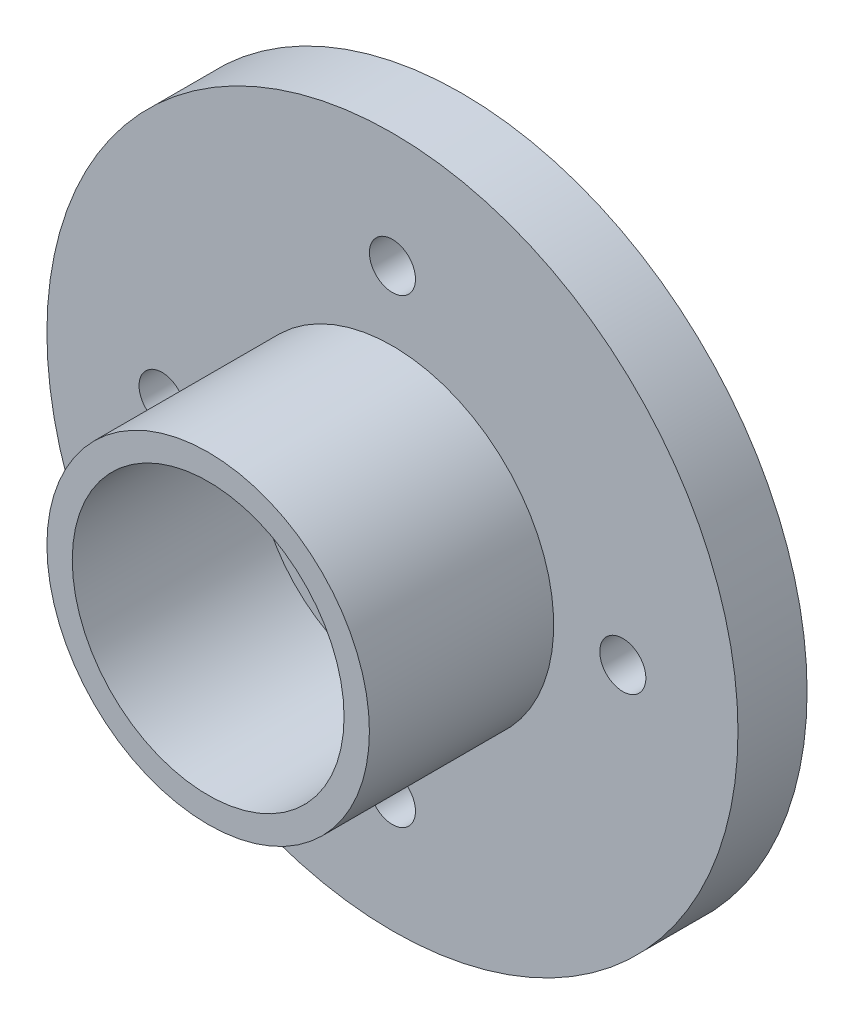
ISO-10303-21;
HEADER;
FILE_DESCRIPTION(('STEP AP214'),'2;1');
FILE_NAME('part.step','',(''),(''),'','','');
FILE_SCHEMA(('AUTOMOTIVE_DESIGN { 1 0 10303 214 1 1 1 1 }'));
ENDSEC;
DATA;
#1=APPLICATION_CONTEXT('core data for automotive mechanical design processes');
#2=APPLICATION_PROTOCOL_DEFINITION('international standard','automotive_design',2000,#1);
#3=PRODUCT_CONTEXT('',#1,'mechanical');
#4=PRODUCT('Part','Part','',(#3));
#5=PRODUCT_RELATED_PRODUCT_CATEGORY('part','',(#4));
#6=PRODUCT_DEFINITION_FORMATION('','',#4);
#7=PRODUCT_DEFINITION_CONTEXT('part definition',#1,'design');
#8=PRODUCT_DEFINITION('design','',#6,#7);
#9=PRODUCT_DEFINITION_SHAPE('','',#8);
#10=(LENGTH_UNIT() NAMED_UNIT(*) SI_UNIT(.MILLI.,.METRE.));
#11=(NAMED_UNIT(*) PLANE_ANGLE_UNIT() SI_UNIT($,.RADIAN.));
#12=(NAMED_UNIT(*) SI_UNIT($,.STERADIAN.) SOLID_ANGLE_UNIT());
#13=UNCERTAINTY_MEASURE_WITH_UNIT(LENGTH_MEASURE(1.E-05),#10,'distance_accuracy_value','');
#14=(GEOMETRIC_REPRESENTATION_CONTEXT(3) GLOBAL_UNCERTAINTY_ASSIGNED_CONTEXT((#13)) GLOBAL_UNIT_ASSIGNED_CONTEXT((#10,
#11,#12)) REPRESENTATION_CONTEXT('',''));
#15=CARTESIAN_POINT('',(0.,0.,0.));
#16=DIRECTION('',(0.,0.,1.));
#17=DIRECTION('',(1.,0.,0.));
#18=AXIS2_PLACEMENT_3D('',#15,#16,#17);
#19=CARTESIAN_POINT('',(0.,0.,4.));
#20=DIRECTION('',(0.,0.,1.));
#21=DIRECTION('',(1.,0.,0.));
#22=AXIS2_PLACEMENT_3D('',#19,#20,#21);
#23=PLANE('',#22);
#24=CARTESIAN_POINT('',(0.,0.,4.));
#25=DIRECTION('',(0.,0.,1.));
#26=DIRECTION('',(1.,0.,0.));
#27=AXIS2_PLACEMENT_3D('',#24,#25,#26);
#28=CIRCLE('',#27,3.5);
#29=CARTESIAN_POINT('',(3.5,0.,4.));
#30=VERTEX_POINT('',#29);
#31=EDGE_CURVE('E10',#30,#30,#28,.T.);
#32=ORIENTED_EDGE('',*,*,#31,.T.);
#33=EDGE_LOOP('',(#32));
#34=FACE_BOUND('',#33,.T.);
#35=CARTESIAN_POINT('',(0.,0.,4.));
#36=DIRECTION('',(0.,0.,1.));
#37=DIRECTION('',(1.,0.,0.));
#38=AXIS2_PLACEMENT_3D('',#35,#36,#37);
#39=CIRCLE('',#38,2.95);
#40=CARTESIAN_POINT('',(2.95,0.,4.));
#41=VERTEX_POINT('',#40);
#42=EDGE_CURVE('E39',#41,#41,#39,.T.);
#43=ORIENTED_EDGE('',*,*,#42,.F.);
#44=EDGE_LOOP('',(#43));
#45=FACE_BOUND('',#44,.T.);
#46=ADVANCED_FACE('F31',(#34,#45),#23,.T.);
#47=CARTESIAN_POINT('',(0.,0.,4.));
#48=DIRECTION('',(0.,0.,-1.));
#49=DIRECTION('',(-1.,0.,0.));
#50=AXIS2_PLACEMENT_3D('',#47,#48,#49);
#51=CYLINDRICAL_SURFACE('',#50,3.5);
#52=ORIENTED_EDGE('',*,*,#31,.F.);
#53=EDGE_LOOP('',(#52));
#54=FACE_BOUND('',#53,.T.);
#55=CARTESIAN_POINT('',(0.,0.,0.));
#56=DIRECTION('',(0.,0.,-1.));
#57=DIRECTION('',(-1.,0.,0.));
#58=AXIS2_PLACEMENT_3D('',#55,#56,#57);
#59=CIRCLE('',#58,3.5);
#60=CARTESIAN_POINT('',(-3.5,0.,0.));
#61=VERTEX_POINT('',#60);
#62=EDGE_CURVE('E76',#61,#61,#59,.T.);
#63=ORIENTED_EDGE('',*,*,#62,.F.);
#64=EDGE_LOOP('',(#63));
#65=FACE_BOUND('',#64,.T.);
#66=ADVANCED_FACE('F33',(#54,#65),#51,.T.);
#67=CARTESIAN_POINT('',(0.,0.,4.));
#68=DIRECTION('',(0.,0.,-1.));
#69=DIRECTION('',(-1.,0.,0.));
#70=AXIS2_PLACEMENT_3D('',#67,#68,#69);
#71=CYLINDRICAL_SURFACE('',#70,2.95);
#72=ORIENTED_EDGE('',*,*,#42,.T.);
#73=EDGE_LOOP('',(#72));
#74=FACE_BOUND('',#73,.T.);
#75=CARTESIAN_POINT('',(0.,0.,0.));
#76=DIRECTION('',(0.,0.,1.));
#77=DIRECTION('',(1.,0.,0.));
#78=AXIS2_PLACEMENT_3D('',#75,#76,#77);
#79=CIRCLE('',#78,2.95);
#80=CARTESIAN_POINT('',(2.95,0.,0.));
#81=VERTEX_POINT('',#80);
#82=EDGE_CURVE('E44',#81,#81,#79,.T.);
#83=ORIENTED_EDGE('',*,*,#82,.F.);
#84=EDGE_LOOP('',(#83));
#85=FACE_BOUND('',#84,.T.);
#86=ADVANCED_FACE('F87',(#74,#85),#71,.F.);
#87=CARTESIAN_POINT('',(0.,0.,0.));
#88=DIRECTION('',(0.,0.,-1.));
#89=DIRECTION('',(-1.,0.,0.));
#90=AXIS2_PLACEMENT_3D('',#87,#88,#89);
#91=PLANE('',#90);
#92=ORIENTED_EDGE('',*,*,#82,.T.);
#93=EDGE_LOOP('',(#92));
#94=FACE_BOUND('',#93,.T.);
#95=ADVANCED_FACE('F85',(#94),#91,.F.);
#96=CARTESIAN_POINT('',(0.,0.,-1.5));
#97=DIRECTION('',(0.,0.,1.));
#98=DIRECTION('',(1.,0.,0.));
#99=AXIS2_PLACEMENT_3D('',#96,#97,#98);
#100=CYLINDRICAL_SURFACE('',#99,7.5);
#101=CARTESIAN_POINT('',(0.,0.,-1.5));
#102=DIRECTION('',(0.,0.,-1.));
#103=DIRECTION('',(-1.,0.,0.));
#104=AXIS2_PLACEMENT_3D('',#101,#102,#103);
#105=CIRCLE('',#104,7.5);
#106=CARTESIAN_POINT('',(-7.5,0.,-1.5));
#107=VERTEX_POINT('',#106);
#108=EDGE_CURVE('E73',#107,#107,#105,.T.);
#109=ORIENTED_EDGE('',*,*,#108,.F.);
#110=EDGE_LOOP('',(#109));
#111=FACE_BOUND('',#110,.T.);
#112=CARTESIAN_POINT('',(0.,0.,0.));
#113=DIRECTION('',(0.,0.,-1.));
#114=DIRECTION('',(-1.,0.,0.));
#115=AXIS2_PLACEMENT_3D('',#112,#113,#114);
#116=CIRCLE('',#115,7.5);
#117=CARTESIAN_POINT('',(-7.5,0.,0.));
#118=VERTEX_POINT('',#117);
#119=EDGE_CURVE('E51',#118,#118,#116,.T.);
#120=ORIENTED_EDGE('',*,*,#119,.T.);
#121=EDGE_LOOP('',(#120));
#122=FACE_BOUND('',#121,.T.);
#123=ADVANCED_FACE('F95',(#111,#122),#100,.T.);
#124=CARTESIAN_POINT('',(0.,0.,-1.5));
#125=DIRECTION('',(0.,0.,-1.));
#126=DIRECTION('',(-1.,0.,0.));
#127=AXIS2_PLACEMENT_3D('',#124,#125,#126);
#128=PLANE('',#127);
#129=CARTESIAN_POINT('',(5.,0.,-1.5));
#130=DIRECTION('',(0.,0.,-1.));
#131=DIRECTION('',(1.,0.,0.));
#132=AXIS2_PLACEMENT_3D('',#129,#130,#131);
#133=CIRCLE('',#132,0.500000000000001);
#134=CARTESIAN_POINT('',(5.5,0.,-1.5));
#135=VERTEX_POINT('',#134);
#136=EDGE_CURVE('E68',#135,#135,#133,.T.);
#137=ORIENTED_EDGE('',*,*,#136,.F.);
#138=EDGE_LOOP('',(#137));
#139=FACE_BOUND('',#138,.T.);
#140=CARTESIAN_POINT('',(0.,-5.,-1.5));
#141=DIRECTION('',(0.,0.,-1.));
#142=DIRECTION('',(1.,0.,0.));
#143=AXIS2_PLACEMENT_3D('',#140,#141,#142);
#144=CIRCLE('',#143,0.499999999999997);
#145=CARTESIAN_POINT('',(0.499999999999995,-5.,-1.5));
#146=VERTEX_POINT('',#145);
#147=EDGE_CURVE('E58',#146,#146,#144,.T.);
#148=ORIENTED_EDGE('',*,*,#147,.F.);
#149=EDGE_LOOP('',(#148));
#150=FACE_BOUND('',#149,.T.);
#151=CARTESIAN_POINT('',(-5.,0.,-1.5));
#152=DIRECTION('',(0.,0.,-1.));
#153=DIRECTION('',(-1.,0.,0.));
#154=AXIS2_PLACEMENT_3D('',#151,#152,#153);
#155=CIRCLE('',#154,0.500000000000001);
#156=CARTESIAN_POINT('',(-5.5,0.,-1.5));
#157=VERTEX_POINT('',#156);
#158=EDGE_CURVE('E55',#157,#157,#155,.T.);
#159=ORIENTED_EDGE('',*,*,#158,.F.);
#160=EDGE_LOOP('',(#159));
#161=FACE_BOUND('',#160,.T.);
#162=CARTESIAN_POINT('',(0.,5.,-1.5));
#163=DIRECTION('',(0.,0.,-1.));
#164=DIRECTION('',(-1.,0.,0.));
#165=AXIS2_PLACEMENT_3D('',#162,#163,#164);
#166=CIRCLE('',#165,0.5);
#167=CARTESIAN_POINT('',(-0.500000000000001,5.,-1.5));
#168=VERTEX_POINT('',#167);
#169=EDGE_CURVE('E52',#168,#168,#166,.T.);
#170=ORIENTED_EDGE('',*,*,#169,.F.);
#171=EDGE_LOOP('',(#170));
#172=FACE_BOUND('',#171,.T.);
#173=ORIENTED_EDGE('',*,*,#108,.T.);
#174=EDGE_LOOP('',(#173));
#175=FACE_BOUND('',#174,.T.);
#176=ADVANCED_FACE('F128',(#139,#150,#161,#172,#175),#128,.T.);
#177=CARTESIAN_POINT('',(5.,0.,0.));
#178=DIRECTION('',(0.,0.,-1.));
#179=DIRECTION('',(-1.,0.,0.));
#180=AXIS2_PLACEMENT_3D('',#177,#178,#179);
#181=CIRCLE('',#180,0.500000000000001);
#182=CARTESIAN_POINT('',(4.5,0.,0.));
#183=VERTEX_POINT('',#182);
#184=EDGE_CURVE('E35',#183,#183,#181,.T.);
#185=ORIENTED_EDGE('',*,*,#184,.T.);
#186=EDGE_LOOP('',(#185));
#187=FACE_BOUND('',#186,.T.);
#188=CARTESIAN_POINT('',(0.,-5.,0.));
#189=DIRECTION('',(0.,0.,-1.));
#190=DIRECTION('',(-1.,0.,0.));
#191=AXIS2_PLACEMENT_3D('',#188,#189,#190);
#192=CIRCLE('',#191,0.499999999999997);
#193=CARTESIAN_POINT('',(-0.499999999999998,-5.,0.));
#194=VERTEX_POINT('',#193);
#195=EDGE_CURVE('E56',#194,#194,#192,.T.);
#196=ORIENTED_EDGE('',*,*,#195,.T.);
#197=EDGE_LOOP('',(#196));
#198=FACE_BOUND('',#197,.T.);
#199=CARTESIAN_POINT('',(-5.,0.,0.));
#200=DIRECTION('',(0.,0.,-1.));
#201=DIRECTION('',(-1.,0.,0.));
#202=AXIS2_PLACEMENT_3D('',#199,#200,#201);
#203=CIRCLE('',#202,0.500000000000001);
#204=CARTESIAN_POINT('',(-5.5,0.,0.));
#205=VERTEX_POINT('',#204);
#206=EDGE_CURVE('E53',#205,#205,#203,.T.);
#207=ORIENTED_EDGE('',*,*,#206,.T.);
#208=EDGE_LOOP('',(#207));
#209=FACE_BOUND('',#208,.T.);
#210=CARTESIAN_POINT('',(0.,5.,0.));
#211=DIRECTION('',(0.,0.,-1.));
#212=DIRECTION('',(-1.,0.,0.));
#213=AXIS2_PLACEMENT_3D('',#210,#211,#212);
#214=CIRCLE('',#213,0.5);
#215=CARTESIAN_POINT('',(-0.500000000000001,5.,0.));
#216=VERTEX_POINT('',#215);
#217=EDGE_CURVE('E48',#216,#216,#214,.T.);
#218=ORIENTED_EDGE('',*,*,#217,.T.);
#219=EDGE_LOOP('',(#218));
#220=FACE_BOUND('',#219,.T.);
#221=ORIENTED_EDGE('',*,*,#62,.T.);
#222=EDGE_LOOP('',(#221));
#223=FACE_BOUND('',#222,.T.);
#224=ORIENTED_EDGE('',*,*,#119,.F.);
#225=EDGE_LOOP('',(#224));
#226=FACE_BOUND('',#225,.T.);
#227=ADVANCED_FACE('F97',(#187,#198,#209,#220,#223,#226),#91,.F.);
#228=CARTESIAN_POINT('',(0.,5.,0.5));
#229=DIRECTION('',(0.,0.,-1.));
#230=DIRECTION('',(-1.,0.,0.));
#231=AXIS2_PLACEMENT_3D('',#228,#229,#230);
#232=CYLINDRICAL_SURFACE('',#231,0.5);
#233=ORIENTED_EDGE('',*,*,#169,.T.);
#234=EDGE_LOOP('',(#233));
#235=FACE_BOUND('',#234,.T.);
#236=ORIENTED_EDGE('',*,*,#217,.F.);
#237=EDGE_LOOP('',(#236));
#238=FACE_BOUND('',#237,.T.);
#239=ADVANCED_FACE('F146',(#235,#238),#232,.F.);
#240=CARTESIAN_POINT('',(-5.,0.,0.5));
#241=DIRECTION('',(0.,0.,-1.));
#242=DIRECTION('',(-1.,0.,0.));
#243=AXIS2_PLACEMENT_3D('',#240,#241,#242);
#244=CYLINDRICAL_SURFACE('',#243,0.500000000000001);
#245=ORIENTED_EDGE('',*,*,#158,.T.);
#246=EDGE_LOOP('',(#245));
#247=FACE_BOUND('',#246,.T.);
#248=ORIENTED_EDGE('',*,*,#206,.F.);
#249=EDGE_LOOP('',(#248));
#250=FACE_BOUND('',#249,.T.);
#251=ADVANCED_FACE('F155',(#247,#250),#244,.F.);
#252=CARTESIAN_POINT('',(0.,-5.,0.5));
#253=DIRECTION('',(0.,0.,-1.));
#254=DIRECTION('',(-1.,0.,0.));
#255=AXIS2_PLACEMENT_3D('',#252,#253,#254);
#256=CYLINDRICAL_SURFACE('',#255,0.499999999999997);
#257=ORIENTED_EDGE('',*,*,#147,.T.);
#258=EDGE_LOOP('',(#257));
#259=FACE_BOUND('',#258,.T.);
#260=ORIENTED_EDGE('',*,*,#195,.F.);
#261=EDGE_LOOP('',(#260));
#262=FACE_BOUND('',#261,.T.);
#263=ADVANCED_FACE('F165',(#259,#262),#256,.F.);
#264=CARTESIAN_POINT('',(5.,0.,0.5));
#265=DIRECTION('',(0.,0.,-1.));
#266=DIRECTION('',(-1.,0.,0.));
#267=AXIS2_PLACEMENT_3D('',#264,#265,#266);
#268=CYLINDRICAL_SURFACE('',#267,0.500000000000001);
#269=ORIENTED_EDGE('',*,*,#136,.T.);
#270=EDGE_LOOP('',(#269));
#271=FACE_BOUND('',#270,.T.);
#272=ORIENTED_EDGE('',*,*,#184,.F.);
#273=EDGE_LOOP('',(#272));
#274=FACE_BOUND('',#273,.T.);
#275=ADVANCED_FACE('F175',(#271,#274),#268,.F.);
#276=CLOSED_SHELL('',(#46,#66,#86,#95,#123,#176,#227,#239,#251,#263,#275));
#277=MANIFOLD_SOLID_BREP('B2',#276);
#278=ADVANCED_BREP_SHAPE_REPRESENTATION('',(#18,#277),#14);
#279=SHAPE_DEFINITION_REPRESENTATION(#9,#278);
ENDSEC;
END-ISO-10303-21;
